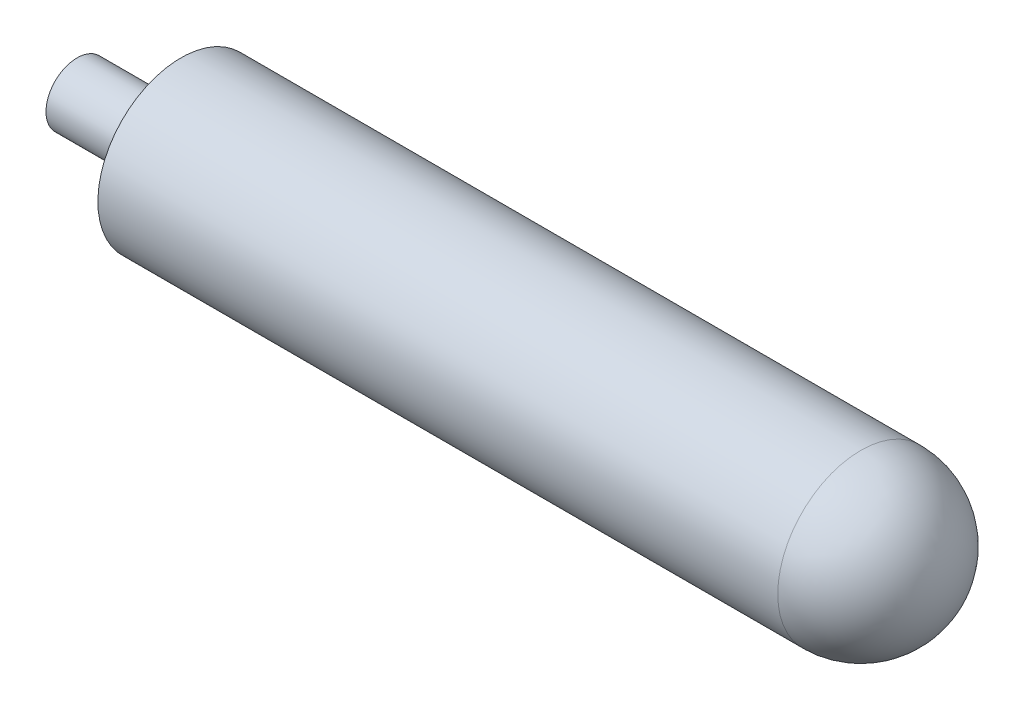
ISO-10303-21;
HEADER;
FILE_DESCRIPTION(('STEP AP214'),'2;1');
FILE_NAME('part.step','',(''),(''),'','','');
FILE_SCHEMA(('AUTOMOTIVE_DESIGN { 1 0 10303 214 1 1 1 1 }'));
ENDSEC;
DATA;
#1=APPLICATION_CONTEXT('core data for automotive mechanical design processes');
#2=APPLICATION_PROTOCOL_DEFINITION('international standard','automotive_design',2000,#1);
#3=PRODUCT_CONTEXT('',#1,'mechanical');
#4=PRODUCT('Part','Part','',(#3));
#5=PRODUCT_RELATED_PRODUCT_CATEGORY('part','',(#4));
#6=PRODUCT_DEFINITION_FORMATION('','',#4);
#7=PRODUCT_DEFINITION_CONTEXT('part definition',#1,'design');
#8=PRODUCT_DEFINITION('design','',#6,#7);
#9=PRODUCT_DEFINITION_SHAPE('','',#8);
#10=(LENGTH_UNIT() NAMED_UNIT(*) SI_UNIT(.MILLI.,.METRE.));
#11=(NAMED_UNIT(*) PLANE_ANGLE_UNIT() SI_UNIT($,.RADIAN.));
#12=(NAMED_UNIT(*) SI_UNIT($,.STERADIAN.) SOLID_ANGLE_UNIT());
#13=UNCERTAINTY_MEASURE_WITH_UNIT(LENGTH_MEASURE(1.E-05),#10,'distance_accuracy_value','');
#14=(GEOMETRIC_REPRESENTATION_CONTEXT(3) GLOBAL_UNCERTAINTY_ASSIGNED_CONTEXT((#13)) GLOBAL_UNIT_ASSIGNED_CONTEXT((#10,
#11,#12)) REPRESENTATION_CONTEXT('',''));
#15=CARTESIAN_POINT('',(0.,0.,0.));
#16=DIRECTION('',(0.,0.,1.));
#17=DIRECTION('',(1.,0.,0.));
#18=AXIS2_PLACEMENT_3D('',#15,#16,#17);
#19=CARTESIAN_POINT('',(6.5,0.,0.));
#20=DIRECTION('',(1.,0.,0.));
#21=DIRECTION('',(0.,1.,0.));
#22=AXIS2_PLACEMENT_3D('',#19,#20,#21);
#23=PLANE('',#22);
#24=CARTESIAN_POINT('',(6.5,0.,0.));
#25=DIRECTION('',(-1.,0.,0.));
#26=DIRECTION('',(0.,-1.,0.));
#27=AXIS2_PLACEMENT_3D('',#24,#25,#26);
#28=CIRCLE('',#27,3.);
#29=CARTESIAN_POINT('',(6.5,-3.,0.));
#30=VERTEX_POINT('',#29);
#31=EDGE_CURVE('E10',#30,#30,#28,.T.);
#32=ORIENTED_EDGE('',*,*,#31,.T.);
#33=EDGE_LOOP('',(#32));
#34=FACE_BOUND('',#33,.T.);
#35=ADVANCED_FACE('F37',(#34),#23,.F.);
#36=CARTESIAN_POINT('',(6.5,0.,0.));
#37=DIRECTION('',(-1.,0.,0.));
#38=DIRECTION('',(0.,-1.,0.));
#39=AXIS2_PLACEMENT_3D('',#36,#37,#38);
#40=CYLINDRICAL_SURFACE('',#39,3.);
#41=ORIENTED_EDGE('',*,*,#31,.F.);
#42=EDGE_LOOP('',(#41));
#43=FACE_BOUND('',#42,.T.);
#44=CARTESIAN_POINT('',(16.5,0.,0.));
#45=DIRECTION('',(-1.,0.,0.));
#46=DIRECTION('',(0.,-1.,0.));
#47=AXIS2_PLACEMENT_3D('',#44,#45,#46);
#48=CIRCLE('',#47,3.);
#49=CARTESIAN_POINT('',(16.5,-3.,0.));
#50=VERTEX_POINT('',#49);
#51=EDGE_CURVE('E43',#50,#50,#48,.T.);
#52=ORIENTED_EDGE('',*,*,#51,.T.);
#53=EDGE_LOOP('',(#52));
#54=FACE_BOUND('',#53,.T.);
#55=ADVANCED_FACE('F69',(#43,#54),#40,.T.);
#56=CARTESIAN_POINT('',(16.5,3.,0.));
#57=DIRECTION('',(1.,0.,0.));
#58=DIRECTION('',(0.,1.,0.));
#59=AXIS2_PLACEMENT_3D('',#56,#57,#58);
#60=PLANE('',#59);
#61=ORIENTED_EDGE('',*,*,#51,.F.);
#62=EDGE_LOOP('',(#61));
#63=FACE_BOUND('',#62,.T.);
#64=CARTESIAN_POINT('',(16.5,0.,0.));
#65=DIRECTION('',(-1.,0.,0.));
#66=DIRECTION('',(0.,-1.,0.));
#67=AXIS2_PLACEMENT_3D('',#64,#65,#66);
#68=CIRCLE('',#67,8.);
#69=CARTESIAN_POINT('',(16.5,-8.,0.));
#70=VERTEX_POINT('',#69);
#71=EDGE_CURVE('E47',#70,#70,#68,.T.);
#72=ORIENTED_EDGE('',*,*,#71,.T.);
#73=EDGE_LOOP('',(#72));
#74=FACE_BOUND('',#73,.T.);
#75=ADVANCED_FACE('F65',(#63,#74),#60,.F.);
#76=CARTESIAN_POINT('',(6.5,0.,0.));
#77=DIRECTION('',(-1.,0.,0.));
#78=DIRECTION('',(0.,-1.,0.));
#79=AXIS2_PLACEMENT_3D('',#76,#77,#78);
#80=CYLINDRICAL_SURFACE('',#79,8.);
#81=ORIENTED_EDGE('',*,*,#71,.F.);
#82=EDGE_LOOP('',(#81));
#83=FACE_BOUND('',#82,.T.);
#84=CARTESIAN_POINT('',(82.,0.,0.));
#85=DIRECTION('',(-1.,0.,0.));
#86=DIRECTION('',(0.,0.,1.));
#87=AXIS2_PLACEMENT_3D('',#84,#85,#86);
#88=CIRCLE('',#87,8.);
#89=CARTESIAN_POINT('',(82.,0.,8.));
#90=VERTEX_POINT('',#89);
#91=EDGE_CURVE('E51',#90,#90,#88,.T.);
#92=ORIENTED_EDGE('',*,*,#91,.T.);
#93=EDGE_LOOP('',(#92));
#94=FACE_BOUND('',#93,.T.);
#95=ADVANCED_FACE('F57',(#83,#94),#80,.T.);
#96=CARTESIAN_POINT('',(82.,0.,0.));
#97=DIRECTION('',(-1.,0.,0.));
#98=DIRECTION('',(0.,1.,0.));
#99=AXIS2_PLACEMENT_3D('',#96,#97,#98);
#100=SPHERICAL_SURFACE('',#99,8.);
#101=ORIENTED_EDGE('',*,*,#91,.F.);
#102=EDGE_LOOP('',(#101));
#103=FACE_BOUND('',#102,.T.);
#104=ADVANCED_FACE('F59',(#103),#100,.T.);
#105=CLOSED_SHELL('',(#35,#55,#75,#95,#104));
#106=MANIFOLD_SOLID_BREP('B2',#105);
#107=ADVANCED_BREP_SHAPE_REPRESENTATION('',(#18,#106),#14);
#108=SHAPE_DEFINITION_REPRESENTATION(#9,#107);
ENDSEC;
END-ISO-10303-21;
